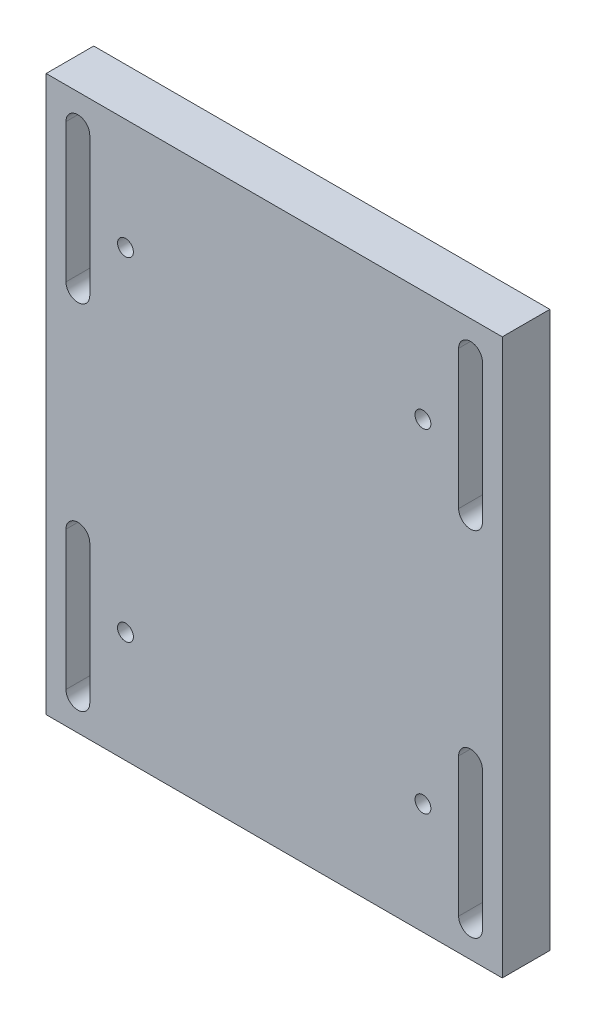
ISO-10303-21;
HEADER;
FILE_DESCRIPTION(('STEP AP214'),'2;1');
FILE_NAME('part.step','',(''),(''),'','','');
FILE_SCHEMA(('AUTOMOTIVE_DESIGN { 1 0 10303 214 1 1 1 1 }'));
ENDSEC;
DATA;
#1=APPLICATION_CONTEXT('core data for automotive mechanical design processes');
#2=APPLICATION_PROTOCOL_DEFINITION('international standard','automotive_design',2000,#1);
#3=PRODUCT_CONTEXT('',#1,'mechanical');
#4=PRODUCT('Part','Part','',(#3));
#5=PRODUCT_RELATED_PRODUCT_CATEGORY('part','',(#4));
#6=PRODUCT_DEFINITION_FORMATION('','',#4);
#7=PRODUCT_DEFINITION_CONTEXT('part definition',#1,'design');
#8=PRODUCT_DEFINITION('design','',#6,#7);
#9=PRODUCT_DEFINITION_SHAPE('','',#8);
#10=(LENGTH_UNIT() NAMED_UNIT(*) SI_UNIT(.MILLI.,.METRE.));
#11=(NAMED_UNIT(*) PLANE_ANGLE_UNIT() SI_UNIT($,.RADIAN.));
#12=(NAMED_UNIT(*) SI_UNIT($,.STERADIAN.) SOLID_ANGLE_UNIT());
#13=UNCERTAINTY_MEASURE_WITH_UNIT(LENGTH_MEASURE(1.E-05),#10,'distance_accuracy_value','');
#14=(GEOMETRIC_REPRESENTATION_CONTEXT(3) GLOBAL_UNCERTAINTY_ASSIGNED_CONTEXT((#13)) GLOBAL_UNIT_ASSIGNED_CONTEXT((#10,
#11,#12)) REPRESENTATION_CONTEXT('',''));
#15=CARTESIAN_POINT('',(0.,0.,0.));
#16=DIRECTION('',(0.,0.,1.));
#17=DIRECTION('',(1.,0.,0.));
#18=AXIS2_PLACEMENT_3D('',#15,#16,#17);
#19=CARTESIAN_POINT('',(57.5,70.,6.));
#20=DIRECTION('',(-1.,0.,0.));
#21=DIRECTION('',(0.,-1.,0.));
#22=AXIS2_PLACEMENT_3D('',#19,#20,#21);
#23=PLANE('',#22);
#24=DIRECTION('',(0.,1.,0.));
#25=VECTOR('',#24,1.);
#26=CARTESIAN_POINT('',(57.5,70.,-6.));
#27=LINE('',#26,#25);
#28=CARTESIAN_POINT('',(57.5,-70.,-6.));
#29=VERTEX_POINT('',#28);
#30=CARTESIAN_POINT('',(57.5,70.,-6.));
#31=VERTEX_POINT('',#30);
#32=EDGE_CURVE('E311',#29,#31,#27,.T.);
#33=ORIENTED_EDGE('',*,*,#32,.T.);
#34=DIRECTION('',(0.,0.,-1.));
#35=VECTOR('',#34,1.);
#36=CARTESIAN_POINT('',(57.5,70.,6.));
#37=LINE('',#36,#35);
#38=CARTESIAN_POINT('',(57.5,70.,6.));
#39=VERTEX_POINT('',#38);
#40=EDGE_CURVE('E11',#39,#31,#37,.T.);
#41=ORIENTED_EDGE('',*,*,#40,.F.);
#42=DIRECTION('',(0.,1.,0.));
#43=VECTOR('',#42,1.);
#44=CARTESIAN_POINT('',(57.5,70.,6.));
#45=LINE('',#44,#43);
#46=CARTESIAN_POINT('',(57.5,-70.,6.));
#47=VERTEX_POINT('',#46);
#48=EDGE_CURVE('E312',#47,#39,#45,.T.);
#49=ORIENTED_EDGE('',*,*,#48,.F.);
#50=DIRECTION('',(0.,0.,-1.));
#51=VECTOR('',#50,1.);
#52=CARTESIAN_POINT('',(57.5,-70.,6.));
#53=LINE('',#52,#51);
#54=EDGE_CURVE('E322',#47,#29,#53,.T.);
#55=ORIENTED_EDGE('',*,*,#54,.T.);
#56=EDGE_LOOP('',(#33,#41,#49,#55));
#57=FACE_BOUND('',#56,.T.);
#58=ADVANCED_FACE('F33',(#57),#23,.F.);
#59=CARTESIAN_POINT('',(-57.5,70.,6.));
#60=DIRECTION('',(0.,-1.,0.));
#61=DIRECTION('',(0.,0.,-1.));
#62=AXIS2_PLACEMENT_3D('',#59,#60,#61);
#63=PLANE('',#62);
#64=DIRECTION('',(-1.,0.,0.));
#65=VECTOR('',#64,1.);
#66=CARTESIAN_POINT('',(-57.5,70.,-6.));
#67=LINE('',#66,#65);
#68=CARTESIAN_POINT('',(-57.5,70.,-6.));
#69=VERTEX_POINT('',#68);
#70=EDGE_CURVE('E325',#31,#69,#67,.T.);
#71=ORIENTED_EDGE('',*,*,#70,.T.);
#72=DIRECTION('',(0.,0.,-1.));
#73=VECTOR('',#72,1.);
#74=CARTESIAN_POINT('',(-57.5,70.,6.));
#75=LINE('',#74,#73);
#76=CARTESIAN_POINT('',(-57.5,70.,6.));
#77=VERTEX_POINT('',#76);
#78=EDGE_CURVE('E40',#77,#69,#75,.T.);
#79=ORIENTED_EDGE('',*,*,#78,.F.);
#80=DIRECTION('',(-1.,0.,0.));
#81=VECTOR('',#80,1.);
#82=CARTESIAN_POINT('',(-57.5,70.,6.));
#83=LINE('',#82,#81);
#84=EDGE_CURVE('E315',#39,#77,#83,.T.);
#85=ORIENTED_EDGE('',*,*,#84,.F.);
#86=ORIENTED_EDGE('',*,*,#40,.T.);
#87=EDGE_LOOP('',(#71,#79,#85,#86));
#88=FACE_BOUND('',#87,.T.);
#89=ADVANCED_FACE('F354',(#88),#63,.F.);
#90=CARTESIAN_POINT('',(-57.5,70.,6.));
#91=DIRECTION('',(1.,0.,0.));
#92=DIRECTION('',(0.,1.,0.));
#93=AXIS2_PLACEMENT_3D('',#90,#91,#92);
#94=PLANE('',#93);
#95=DIRECTION('',(0.,-1.,0.));
#96=VECTOR('',#95,1.);
#97=CARTESIAN_POINT('',(-57.5,70.,-6.));
#98=LINE('',#97,#96);
#99=CARTESIAN_POINT('',(-57.5,-70.,-6.));
#100=VERTEX_POINT('',#99);
#101=EDGE_CURVE('E327',#69,#100,#98,.T.);
#102=ORIENTED_EDGE('',*,*,#101,.T.);
#103=DIRECTION('',(0.,0.,-1.));
#104=VECTOR('',#103,1.);
#105=CARTESIAN_POINT('',(-57.5,-70.,6.));
#106=LINE('',#105,#104);
#107=CARTESIAN_POINT('',(-57.5,-70.,6.));
#108=VERTEX_POINT('',#107);
#109=EDGE_CURVE('E332',#108,#100,#106,.T.);
#110=ORIENTED_EDGE('',*,*,#109,.F.);
#111=DIRECTION('',(0.,-1.,0.));
#112=VECTOR('',#111,1.);
#113=CARTESIAN_POINT('',(-57.5,70.,6.));
#114=LINE('',#113,#112);
#115=EDGE_CURVE('E318',#77,#108,#114,.T.);
#116=ORIENTED_EDGE('',*,*,#115,.F.);
#117=ORIENTED_EDGE('',*,*,#78,.T.);
#118=EDGE_LOOP('',(#102,#110,#116,#117));
#119=FACE_BOUND('',#118,.T.);
#120=ADVANCED_FACE('F339',(#119),#94,.F.);
#121=CARTESIAN_POINT('',(-57.5,-70.,6.));
#122=DIRECTION('',(0.,1.,0.));
#123=DIRECTION('',(0.,0.,1.));
#124=AXIS2_PLACEMENT_3D('',#121,#122,#123);
#125=PLANE('',#124);
#126=DIRECTION('',(1.,0.,0.));
#127=VECTOR('',#126,1.);
#128=CARTESIAN_POINT('',(-57.5,-70.,-6.));
#129=LINE('',#128,#127);
#130=EDGE_CURVE('E316',#100,#29,#129,.T.);
#131=ORIENTED_EDGE('',*,*,#130,.T.);
#132=ORIENTED_EDGE('',*,*,#54,.F.);
#133=DIRECTION('',(1.,0.,0.));
#134=VECTOR('',#133,1.);
#135=CARTESIAN_POINT('',(-57.5,-70.,6.));
#136=LINE('',#135,#134);
#137=EDGE_CURVE('E320',#108,#47,#136,.T.);
#138=ORIENTED_EDGE('',*,*,#137,.F.);
#139=ORIENTED_EDGE('',*,*,#109,.T.);
#140=EDGE_LOOP('',(#131,#132,#138,#139));
#141=FACE_BOUND('',#140,.T.);
#142=ADVANCED_FACE('F348',(#141),#125,.F.);
#143=CARTESIAN_POINT('',(0.,0.,6.));
#144=DIRECTION('',(0.,0.,1.));
#145=DIRECTION('',(1.,0.,0.));
#146=AXIS2_PLACEMENT_3D('',#143,#144,#145);
#147=PLANE('',#146);
#148=CARTESIAN_POINT('',(-37.5,42.,6.));
#149=DIRECTION('',(0.,0.,-1.));
#150=DIRECTION('',(-1.,0.,0.));
#151=AXIS2_PLACEMENT_3D('',#148,#149,#150);
#152=CIRCLE('',#151,2.);
#153=CARTESIAN_POINT('',(-39.5,42.,6.));
#154=VERTEX_POINT('',#153);
#155=EDGE_CURVE('E451',#154,#154,#152,.T.);
#156=ORIENTED_EDGE('',*,*,#155,.T.);
#157=EDGE_LOOP('',(#156));
#158=FACE_BOUND('',#157,.T.);
#159=CARTESIAN_POINT('',(-49.5,27.,6.));
#160=DIRECTION('',(0.,0.,-1.));
#161=DIRECTION('',(-1.,0.,0.));
#162=AXIS2_PLACEMENT_3D('',#159,#160,#161);
#163=CIRCLE('',#162,3.);
#164=CARTESIAN_POINT('',(-46.5,27.,6.));
#165=VERTEX_POINT('',#164);
#166=CARTESIAN_POINT('',(-52.5,27.,6.));
#167=VERTEX_POINT('',#166);
#168=EDGE_CURVE('E189',#165,#167,#163,.T.);
#169=ORIENTED_EDGE('',*,*,#168,.T.);
#170=DIRECTION('',(0.,1.,0.));
#171=VECTOR('',#170,1.);
#172=CARTESIAN_POINT('',(-52.5,62.,6.));
#173=LINE('',#172,#171);
#174=CARTESIAN_POINT('',(-52.5,62.,6.));
#175=VERTEX_POINT('',#174);
#176=EDGE_CURVE('E172',#167,#175,#173,.T.);
#177=ORIENTED_EDGE('',*,*,#176,.T.);
#178=CARTESIAN_POINT('',(-49.5,62.,6.));
#179=DIRECTION('',(0.,0.,-1.));
#180=DIRECTION('',(-1.,0.,0.));
#181=AXIS2_PLACEMENT_3D('',#178,#179,#180);
#182=CIRCLE('',#181,3.);
#183=CARTESIAN_POINT('',(-46.5,62.,6.));
#184=VERTEX_POINT('',#183);
#185=EDGE_CURVE('E180',#175,#184,#182,.T.);
#186=ORIENTED_EDGE('',*,*,#185,.T.);
#187=DIRECTION('',(0.,-1.,0.));
#188=VECTOR('',#187,1.);
#189=CARTESIAN_POINT('',(-46.5,27.,6.));
#190=LINE('',#189,#188);
#191=EDGE_CURVE('E47',#184,#165,#190,.T.);
#192=ORIENTED_EDGE('',*,*,#191,.T.);
#193=EDGE_LOOP('',(#169,#177,#186,#192));
#194=FACE_BOUND('',#193,.T.);
#195=CARTESIAN_POINT('',(-37.5,-42.,6.));
#196=DIRECTION('',(0.,0.,1.));
#197=DIRECTION('',(-1.,0.,0.));
#198=AXIS2_PLACEMENT_3D('',#195,#196,#197);
#199=CIRCLE('',#198,2.);
#200=CARTESIAN_POINT('',(-39.5,-42.,6.));
#201=VERTEX_POINT('',#200);
#202=EDGE_CURVE('E201',#201,#201,#199,.T.);
#203=ORIENTED_EDGE('',*,*,#202,.F.);
#204=EDGE_LOOP('',(#203));
#205=FACE_BOUND('',#204,.T.);
#206=CARTESIAN_POINT('',(-49.5,-62.,6.));
#207=DIRECTION('',(0.,0.,1.));
#208=DIRECTION('',(-1.,0.,0.));
#209=AXIS2_PLACEMENT_3D('',#206,#207,#208);
#210=CIRCLE('',#209,3.);
#211=CARTESIAN_POINT('',(-52.5,-62.,6.));
#212=VERTEX_POINT('',#211);
#213=CARTESIAN_POINT('',(-46.5,-62.,6.));
#214=VERTEX_POINT('',#213);
#215=EDGE_CURVE('E208',#212,#214,#210,.T.);
#216=ORIENTED_EDGE('',*,*,#215,.F.);
#217=DIRECTION('',(0.,-1.,0.));
#218=VECTOR('',#217,1.);
#219=CARTESIAN_POINT('',(-52.5,-62.,6.));
#220=LINE('',#219,#218);
#221=CARTESIAN_POINT('',(-52.5,-27.,6.));
#222=VERTEX_POINT('',#221);
#223=EDGE_CURVE('E225',#222,#212,#220,.T.);
#224=ORIENTED_EDGE('',*,*,#223,.F.);
#225=CARTESIAN_POINT('',(-49.5,-27.,6.));
#226=DIRECTION('',(0.,0.,1.));
#227=DIRECTION('',(-1.,0.,0.));
#228=AXIS2_PLACEMENT_3D('',#225,#226,#227);
#229=CIRCLE('',#228,3.);
#230=CARTESIAN_POINT('',(-46.5,-27.,6.));
#231=VERTEX_POINT('',#230);
#232=EDGE_CURVE('E222',#231,#222,#229,.T.);
#233=ORIENTED_EDGE('',*,*,#232,.F.);
#234=DIRECTION('',(0.,1.,0.));
#235=VECTOR('',#234,1.);
#236=CARTESIAN_POINT('',(-46.5,-27.,6.));
#237=LINE('',#236,#235);
#238=EDGE_CURVE('E219',#214,#231,#237,.T.);
#239=ORIENTED_EDGE('',*,*,#238,.F.);
#240=EDGE_LOOP('',(#216,#224,#233,#239));
#241=FACE_BOUND('',#240,.T.);
#242=CARTESIAN_POINT('',(37.5,-42.,6.));
#243=DIRECTION('',(0.,0.,-1.));
#244=DIRECTION('',(1.,0.,0.));
#245=AXIS2_PLACEMENT_3D('',#242,#243,#244);
#246=CIRCLE('',#245,2.);
#247=CARTESIAN_POINT('',(39.5,-42.,6.));
#248=VERTEX_POINT('',#247);
#249=EDGE_CURVE('E237',#248,#248,#246,.T.);
#250=ORIENTED_EDGE('',*,*,#249,.T.);
#251=EDGE_LOOP('',(#250));
#252=FACE_BOUND('',#251,.T.);
#253=CARTESIAN_POINT('',(49.5,-27.,6.));
#254=DIRECTION('',(0.,0.,-1.));
#255=DIRECTION('',(1.,0.,0.));
#256=AXIS2_PLACEMENT_3D('',#253,#254,#255);
#257=CIRCLE('',#256,3.);
#258=CARTESIAN_POINT('',(46.5,-27.,6.));
#259=VERTEX_POINT('',#258);
#260=CARTESIAN_POINT('',(52.5,-27.,6.));
#261=VERTEX_POINT('',#260);
#262=EDGE_CURVE('E260',#259,#261,#257,.T.);
#263=ORIENTED_EDGE('',*,*,#262,.T.);
#264=DIRECTION('',(0.,-1.,0.));
#265=VECTOR('',#264,1.);
#266=CARTESIAN_POINT('',(52.5,-62.,6.));
#267=LINE('',#266,#265);
#268=CARTESIAN_POINT('',(52.5,-62.,6.));
#269=VERTEX_POINT('',#268);
#270=EDGE_CURVE('E257',#261,#269,#267,.T.);
#271=ORIENTED_EDGE('',*,*,#270,.T.);
#272=CARTESIAN_POINT('',(49.5,-62.,6.));
#273=DIRECTION('',(0.,0.,-1.));
#274=DIRECTION('',(1.,0.,0.));
#275=AXIS2_PLACEMENT_3D('',#272,#273,#274);
#276=CIRCLE('',#275,3.);
#277=CARTESIAN_POINT('',(46.5,-62.,6.));
#278=VERTEX_POINT('',#277);
#279=EDGE_CURVE('E243',#269,#278,#276,.T.);
#280=ORIENTED_EDGE('',*,*,#279,.T.);
#281=DIRECTION('',(0.,1.,0.));
#282=VECTOR('',#281,1.);
#283=CARTESIAN_POINT('',(46.5,-27.,6.));
#284=LINE('',#283,#282);
#285=EDGE_CURVE('E263',#278,#259,#284,.T.);
#286=ORIENTED_EDGE('',*,*,#285,.T.);
#287=EDGE_LOOP('',(#263,#271,#280,#286));
#288=FACE_BOUND('',#287,.T.);
#289=CARTESIAN_POINT('',(37.5,42.,6.));
#290=DIRECTION('',(0.,0.,1.));
#291=DIRECTION('',(1.,0.,0.));
#292=AXIS2_PLACEMENT_3D('',#289,#290,#291);
#293=CIRCLE('',#292,2.);
#294=CARTESIAN_POINT('',(39.5,42.,6.));
#295=VERTEX_POINT('',#294);
#296=EDGE_CURVE('E254',#295,#295,#293,.T.);
#297=ORIENTED_EDGE('',*,*,#296,.F.);
#298=EDGE_LOOP('',(#297));
#299=FACE_BOUND('',#298,.T.);
#300=CARTESIAN_POINT('',(49.5,62.,6.));
#301=DIRECTION('',(0.,0.,1.));
#302=DIRECTION('',(1.,0.,0.));
#303=AXIS2_PLACEMENT_3D('',#300,#301,#302);
#304=CIRCLE('',#303,3.);
#305=CARTESIAN_POINT('',(52.5,62.,6.));
#306=VERTEX_POINT('',#305);
#307=CARTESIAN_POINT('',(46.5,62.,6.));
#308=VERTEX_POINT('',#307);
#309=EDGE_CURVE('E282',#306,#308,#304,.T.);
#310=ORIENTED_EDGE('',*,*,#309,.F.);
#311=DIRECTION('',(0.,1.,0.));
#312=VECTOR('',#311,1.);
#313=CARTESIAN_POINT('',(52.5,62.,6.));
#314=LINE('',#313,#312);
#315=CARTESIAN_POINT('',(52.5,27.,6.));
#316=VERTEX_POINT('',#315);
#317=EDGE_CURVE('E299',#316,#306,#314,.T.);
#318=ORIENTED_EDGE('',*,*,#317,.F.);
#319=CARTESIAN_POINT('',(49.5,27.,6.));
#320=DIRECTION('',(0.,0.,1.));
#321=DIRECTION('',(1.,0.,0.));
#322=AXIS2_PLACEMENT_3D('',#319,#320,#321);
#323=CIRCLE('',#322,3.);
#324=CARTESIAN_POINT('',(46.5,27.,6.));
#325=VERTEX_POINT('',#324);
#326=EDGE_CURVE('E296',#325,#316,#323,.T.);
#327=ORIENTED_EDGE('',*,*,#326,.F.);
#328=DIRECTION('',(0.,-1.,0.));
#329=VECTOR('',#328,1.);
#330=CARTESIAN_POINT('',(46.5,27.,6.));
#331=LINE('',#330,#329);
#332=EDGE_CURVE('E293',#308,#325,#331,.T.);
#333=ORIENTED_EDGE('',*,*,#332,.F.);
#334=EDGE_LOOP('',(#310,#318,#327,#333));
#335=FACE_BOUND('',#334,.T.);
#336=ORIENTED_EDGE('',*,*,#48,.T.);
#337=ORIENTED_EDGE('',*,*,#84,.T.);
#338=ORIENTED_EDGE('',*,*,#115,.T.);
#339=ORIENTED_EDGE('',*,*,#137,.T.);
#340=EDGE_LOOP('',(#336,#337,#338,#339));
#341=FACE_BOUND('',#340,.T.);
#342=ADVANCED_FACE('F186',(#158,#194,#205,#241,#252,#288,#299,#335,#341),#147,.T.);
#343=CARTESIAN_POINT('',(0.,0.,-6.));
#344=DIRECTION('',(0.,0.,1.));
#345=DIRECTION('',(1.,0.,0.));
#346=AXIS2_PLACEMENT_3D('',#343,#344,#345);
#347=PLANE('',#346);
#348=CARTESIAN_POINT('',(-37.5,42.,-6.));
#349=DIRECTION('',(0.,0.,1.));
#350=DIRECTION('',(1.,0.,0.));
#351=AXIS2_PLACEMENT_3D('',#348,#349,#350);
#352=CIRCLE('',#351,2.);
#353=CARTESIAN_POINT('',(-35.5,42.,-6.));
#354=VERTEX_POINT('',#353);
#355=EDGE_CURVE('E184',#354,#354,#352,.T.);
#356=ORIENTED_EDGE('',*,*,#355,.T.);
#357=EDGE_LOOP('',(#356));
#358=FACE_BOUND('',#357,.T.);
#359=DIRECTION('',(0.,-1.,0.));
#360=VECTOR('',#359,1.);
#361=CARTESIAN_POINT('',(-52.5,62.,-6.));
#362=LINE('',#361,#360);
#363=CARTESIAN_POINT('',(-52.5,62.,-6.));
#364=VERTEX_POINT('',#363);
#365=CARTESIAN_POINT('',(-52.5,27.,-6.));
#366=VERTEX_POINT('',#365);
#367=EDGE_CURVE('E175',#364,#366,#362,.T.);
#368=ORIENTED_EDGE('',*,*,#367,.T.);
#369=CARTESIAN_POINT('',(-49.5,27.,-6.));
#370=DIRECTION('',(0.,0.,1.));
#371=DIRECTION('',(1.,0.,0.));
#372=AXIS2_PLACEMENT_3D('',#369,#370,#371);
#373=CIRCLE('',#372,3.);
#374=CARTESIAN_POINT('',(-46.5,27.,-6.));
#375=VERTEX_POINT('',#374);
#376=EDGE_CURVE('E200',#366,#375,#373,.T.);
#377=ORIENTED_EDGE('',*,*,#376,.T.);
#378=DIRECTION('',(0.,1.,0.));
#379=VECTOR('',#378,1.);
#380=CARTESIAN_POINT('',(-46.5,27.,-6.));
#381=LINE('',#380,#379);
#382=CARTESIAN_POINT('',(-46.5,62.,-6.));
#383=VERTEX_POINT('',#382);
#384=EDGE_CURVE('E457',#375,#383,#381,.T.);
#385=ORIENTED_EDGE('',*,*,#384,.T.);
#386=CARTESIAN_POINT('',(-49.5,62.,-6.));
#387=DIRECTION('',(0.,0.,1.));
#388=DIRECTION('',(1.,0.,0.));
#389=AXIS2_PLACEMENT_3D('',#386,#387,#388);
#390=CIRCLE('',#389,3.);
#391=EDGE_CURVE('E205',#383,#364,#390,.T.);
#392=ORIENTED_EDGE('',*,*,#391,.T.);
#393=EDGE_LOOP('',(#368,#377,#385,#392));
#394=FACE_BOUND('',#393,.T.);
#395=CARTESIAN_POINT('',(-37.5,-42.,-6.));
#396=DIRECTION('',(0.,0.,1.));
#397=DIRECTION('',(1.,0.,0.));
#398=AXIS2_PLACEMENT_3D('',#395,#396,#397);
#399=CIRCLE('',#398,2.);
#400=CARTESIAN_POINT('',(-35.5,-42.,-6.));
#401=VERTEX_POINT('',#400);
#402=EDGE_CURVE('E204',#401,#401,#399,.F.);
#403=ORIENTED_EDGE('',*,*,#402,.F.);
#404=EDGE_LOOP('',(#403));
#405=FACE_BOUND('',#404,.T.);
#406=DIRECTION('',(0.,1.,0.));
#407=VECTOR('',#406,1.);
#408=CARTESIAN_POINT('',(-52.5,-62.,-6.));
#409=LINE('',#408,#407);
#410=CARTESIAN_POINT('',(-52.5,-62.,-6.));
#411=VERTEX_POINT('',#410);
#412=CARTESIAN_POINT('',(-52.5,-27.,-6.));
#413=VERTEX_POINT('',#412);
#414=EDGE_CURVE('E212',#411,#413,#409,.T.);
#415=ORIENTED_EDGE('',*,*,#414,.F.);
#416=CARTESIAN_POINT('',(-49.5,-62.,-6.));
#417=DIRECTION('',(0.,0.,1.));
#418=DIRECTION('',(1.,0.,0.));
#419=AXIS2_PLACEMENT_3D('',#416,#417,#418);
#420=CIRCLE('',#419,3.);
#421=CARTESIAN_POINT('',(-46.5,-62.,-6.));
#422=VERTEX_POINT('',#421);
#423=EDGE_CURVE('E215',#422,#411,#420,.F.);
#424=ORIENTED_EDGE('',*,*,#423,.F.);
#425=DIRECTION('',(0.,-1.,0.));
#426=VECTOR('',#425,1.);
#427=CARTESIAN_POINT('',(-46.5,-27.,-6.));
#428=LINE('',#427,#426);
#429=CARTESIAN_POINT('',(-46.5,-27.,-6.));
#430=VERTEX_POINT('',#429);
#431=EDGE_CURVE('E217',#430,#422,#428,.T.);
#432=ORIENTED_EDGE('',*,*,#431,.F.);
#433=CARTESIAN_POINT('',(-49.5,-27.,-6.));
#434=DIRECTION('',(0.,0.,1.));
#435=DIRECTION('',(1.,0.,0.));
#436=AXIS2_PLACEMENT_3D('',#433,#434,#435);
#437=CIRCLE('',#436,3.);
#438=EDGE_CURVE('E209',#413,#430,#437,.F.);
#439=ORIENTED_EDGE('',*,*,#438,.F.);
#440=EDGE_LOOP('',(#415,#424,#432,#439));
#441=FACE_BOUND('',#440,.T.);
#442=CARTESIAN_POINT('',(37.5,-42.,-6.));
#443=DIRECTION('',(0.,0.,1.));
#444=DIRECTION('',(1.,0.,0.));
#445=AXIS2_PLACEMENT_3D('',#442,#443,#444);
#446=CIRCLE('',#445,2.);
#447=CARTESIAN_POINT('',(39.5,-42.,-6.));
#448=VERTEX_POINT('',#447);
#449=EDGE_CURVE('E240',#448,#448,#446,.T.);
#450=ORIENTED_EDGE('',*,*,#449,.T.);
#451=EDGE_LOOP('',(#450));
#452=FACE_BOUND('',#451,.T.);
#453=DIRECTION('',(0.,1.,0.));
#454=VECTOR('',#453,1.);
#455=CARTESIAN_POINT('',(52.5,-62.,-6.));
#456=LINE('',#455,#454);
#457=CARTESIAN_POINT('',(52.5,-62.,-6.));
#458=VERTEX_POINT('',#457);
#459=CARTESIAN_POINT('',(52.5,-27.,-6.));
#460=VERTEX_POINT('',#459);
#461=EDGE_CURVE('E248',#458,#460,#456,.T.);
#462=ORIENTED_EDGE('',*,*,#461,.T.);
#463=CARTESIAN_POINT('',(49.5,-27.,-6.));
#464=DIRECTION('',(0.,0.,1.));
#465=DIRECTION('',(1.,0.,0.));
#466=AXIS2_PLACEMENT_3D('',#463,#464,#465);
#467=CIRCLE('',#466,3.);
#468=CARTESIAN_POINT('',(46.5,-27.,-6.));
#469=VERTEX_POINT('',#468);
#470=EDGE_CURVE('E244',#460,#469,#467,.T.);
#471=ORIENTED_EDGE('',*,*,#470,.T.);
#472=DIRECTION('',(0.,-1.,0.));
#473=VECTOR('',#472,1.);
#474=CARTESIAN_POINT('',(46.5,-27.,-6.));
#475=LINE('',#474,#473);
#476=CARTESIAN_POINT('',(46.5,-62.,-6.));
#477=VERTEX_POINT('',#476);
#478=EDGE_CURVE('E247',#469,#477,#475,.T.);
#479=ORIENTED_EDGE('',*,*,#478,.T.);
#480=CARTESIAN_POINT('',(49.5,-62.,-6.));
#481=DIRECTION('',(0.,0.,1.));
#482=DIRECTION('',(1.,0.,0.));
#483=AXIS2_PLACEMENT_3D('',#480,#481,#482);
#484=CIRCLE('',#483,3.);
#485=EDGE_CURVE('E251',#477,#458,#484,.T.);
#486=ORIENTED_EDGE('',*,*,#485,.T.);
#487=EDGE_LOOP('',(#462,#471,#479,#486));
#488=FACE_BOUND('',#487,.T.);
#489=CARTESIAN_POINT('',(37.5,42.,-6.));
#490=DIRECTION('',(0.,0.,1.));
#491=DIRECTION('',(1.,0.,0.));
#492=AXIS2_PLACEMENT_3D('',#489,#490,#491);
#493=CIRCLE('',#492,2.);
#494=CARTESIAN_POINT('',(39.5,42.,-6.));
#495=VERTEX_POINT('',#494);
#496=EDGE_CURVE('E279',#495,#495,#493,.F.);
#497=ORIENTED_EDGE('',*,*,#496,.F.);
#498=EDGE_LOOP('',(#497));
#499=FACE_BOUND('',#498,.T.);
#500=DIRECTION('',(0.,-1.,0.));
#501=VECTOR('',#500,1.);
#502=CARTESIAN_POINT('',(52.5,62.,-6.));
#503=LINE('',#502,#501);
#504=CARTESIAN_POINT('',(52.5,62.,-6.));
#505=VERTEX_POINT('',#504);
#506=CARTESIAN_POINT('',(52.5,27.,-6.));
#507=VERTEX_POINT('',#506);
#508=EDGE_CURVE('E286',#505,#507,#503,.T.);
#509=ORIENTED_EDGE('',*,*,#508,.F.);
#510=CARTESIAN_POINT('',(49.5,62.,-6.));
#511=DIRECTION('',(0.,0.,1.));
#512=DIRECTION('',(1.,0.,0.));
#513=AXIS2_PLACEMENT_3D('',#510,#511,#512);
#514=CIRCLE('',#513,3.);
#515=CARTESIAN_POINT('',(46.5,62.,-6.));
#516=VERTEX_POINT('',#515);
#517=EDGE_CURVE('E289',#516,#505,#514,.F.);
#518=ORIENTED_EDGE('',*,*,#517,.F.);
#519=DIRECTION('',(0.,1.,0.));
#520=VECTOR('',#519,1.);
#521=CARTESIAN_POINT('',(46.5,27.,-6.));
#522=LINE('',#521,#520);
#523=CARTESIAN_POINT('',(46.5,27.,-6.));
#524=VERTEX_POINT('',#523);
#525=EDGE_CURVE('E291',#524,#516,#522,.T.);
#526=ORIENTED_EDGE('',*,*,#525,.F.);
#527=CARTESIAN_POINT('',(49.5,27.,-6.));
#528=DIRECTION('',(0.,0.,1.));
#529=DIRECTION('',(1.,0.,0.));
#530=AXIS2_PLACEMENT_3D('',#527,#528,#529);
#531=CIRCLE('',#530,3.);
#532=EDGE_CURVE('E283',#507,#524,#531,.F.);
#533=ORIENTED_EDGE('',*,*,#532,.F.);
#534=EDGE_LOOP('',(#509,#518,#526,#533));
#535=FACE_BOUND('',#534,.T.);
#536=ORIENTED_EDGE('',*,*,#32,.F.);
#537=ORIENTED_EDGE('',*,*,#130,.F.);
#538=ORIENTED_EDGE('',*,*,#101,.F.);
#539=ORIENTED_EDGE('',*,*,#70,.F.);
#540=EDGE_LOOP('',(#536,#537,#538,#539));
#541=FACE_BOUND('',#540,.T.);
#542=ADVANCED_FACE('F345',(#358,#394,#405,#441,#452,#488,#499,#535,#541),#347,.F.);
#543=CARTESIAN_POINT('',(49.5,62.,-47.4366987102013));
#544=DIRECTION('',(0.,0.,1.));
#545=DIRECTION('',(1.,0.,0.));
#546=AXIS2_PLACEMENT_3D('',#543,#544,#545);
#547=CYLINDRICAL_SURFACE('',#546,3.);
#548=ORIENTED_EDGE('',*,*,#517,.T.);
#549=DIRECTION('',(0.,0.,1.));
#550=VECTOR('',#549,1.);
#551=CARTESIAN_POINT('',(52.5,62.,-47.4366987102013));
#552=LINE('',#551,#550);
#553=EDGE_CURVE('E287',#505,#306,#552,.T.);
#554=ORIENTED_EDGE('',*,*,#553,.T.);
#555=ORIENTED_EDGE('',*,*,#309,.T.);
#556=DIRECTION('',(0.,0.,1.));
#557=VECTOR('',#556,1.);
#558=CARTESIAN_POINT('',(46.5,62.,-47.4366987102013));
#559=LINE('',#558,#557);
#560=EDGE_CURVE('E302',#516,#308,#559,.T.);
#561=ORIENTED_EDGE('',*,*,#560,.F.);
#562=EDGE_LOOP('',(#548,#554,#555,#561));
#563=FACE_BOUND('',#562,.T.);
#564=ADVANCED_FACE('F366',(#563),#547,.F.);
#565=CARTESIAN_POINT('',(52.5,62.,-47.4366987102013));
#566=DIRECTION('',(1.,0.,0.));
#567=DIRECTION('',(0.,0.,-1.));
#568=AXIS2_PLACEMENT_3D('',#565,#566,#567);
#569=PLANE('',#568);
#570=ORIENTED_EDGE('',*,*,#508,.T.);
#571=DIRECTION('',(0.,0.,1.));
#572=VECTOR('',#571,1.);
#573=CARTESIAN_POINT('',(52.5,27.,-47.4366987102013));
#574=LINE('',#573,#572);
#575=EDGE_CURVE('E304',#507,#316,#574,.T.);
#576=ORIENTED_EDGE('',*,*,#575,.T.);
#577=ORIENTED_EDGE('',*,*,#317,.T.);
#578=ORIENTED_EDGE('',*,*,#553,.F.);
#579=EDGE_LOOP('',(#570,#576,#577,#578));
#580=FACE_BOUND('',#579,.T.);
#581=ADVANCED_FACE('F373',(#580),#569,.F.);
#582=CARTESIAN_POINT('',(49.5,27.,-47.4366987102013));
#583=DIRECTION('',(0.,0.,1.));
#584=DIRECTION('',(1.,0.,0.));
#585=AXIS2_PLACEMENT_3D('',#582,#583,#584);
#586=CYLINDRICAL_SURFACE('',#585,3.);
#587=ORIENTED_EDGE('',*,*,#532,.T.);
#588=DIRECTION('',(0.,0.,1.));
#589=VECTOR('',#588,1.);
#590=CARTESIAN_POINT('',(46.5,27.,-47.4366987102013));
#591=LINE('',#590,#589);
#592=EDGE_CURVE('E306',#524,#325,#591,.T.);
#593=ORIENTED_EDGE('',*,*,#592,.T.);
#594=ORIENTED_EDGE('',*,*,#326,.T.);
#595=ORIENTED_EDGE('',*,*,#575,.F.);
#596=EDGE_LOOP('',(#587,#593,#594,#595));
#597=FACE_BOUND('',#596,.T.);
#598=ADVANCED_FACE('F379',(#597),#586,.F.);
#599=CARTESIAN_POINT('',(46.5,27.,-47.4366987102013));
#600=DIRECTION('',(-1.,0.,0.));
#601=DIRECTION('',(0.,0.,1.));
#602=AXIS2_PLACEMENT_3D('',#599,#600,#601);
#603=PLANE('',#602);
#604=ORIENTED_EDGE('',*,*,#525,.T.);
#605=ORIENTED_EDGE('',*,*,#560,.T.);
#606=ORIENTED_EDGE('',*,*,#332,.T.);
#607=ORIENTED_EDGE('',*,*,#592,.F.);
#608=EDGE_LOOP('',(#604,#605,#606,#607));
#609=FACE_BOUND('',#608,.T.);
#610=ADVANCED_FACE('F375',(#609),#603,.F.);
#611=CARTESIAN_POINT('',(37.5,42.,-11.6568542494924));
#612=DIRECTION('',(0.,0.,1.));
#613=DIRECTION('',(1.,0.,0.));
#614=AXIS2_PLACEMENT_3D('',#611,#612,#613);
#615=CYLINDRICAL_SURFACE('',#614,2.);
#616=ORIENTED_EDGE('',*,*,#496,.T.);
#617=EDGE_LOOP('',(#616));
#618=FACE_BOUND('',#617,.T.);
#619=ORIENTED_EDGE('',*,*,#296,.T.);
#620=EDGE_LOOP('',(#619));
#621=FACE_BOUND('',#620,.T.);
#622=ADVANCED_FACE('F378',(#618,#621),#615,.F.);
#623=CARTESIAN_POINT('',(52.5,-62.,-47.4366987102013));
#624=DIRECTION('',(-1.,0.,0.));
#625=DIRECTION('',(0.,0.,1.));
#626=AXIS2_PLACEMENT_3D('',#623,#624,#625);
#627=PLANE('',#626);
#628=DIRECTION('',(0.,0.,1.));
#629=VECTOR('',#628,1.);
#630=CARTESIAN_POINT('',(52.5,-62.,-47.4366987102013));
#631=LINE('',#630,#629);
#632=EDGE_CURVE('E266',#458,#269,#631,.T.);
#633=ORIENTED_EDGE('',*,*,#632,.T.);
#634=ORIENTED_EDGE('',*,*,#270,.F.);
#635=DIRECTION('',(0.,0.,1.));
#636=VECTOR('',#635,1.);
#637=CARTESIAN_POINT('',(52.5,-27.,-47.4366987102013));
#638=LINE('',#637,#636);
#639=EDGE_CURVE('E272',#460,#261,#638,.T.);
#640=ORIENTED_EDGE('',*,*,#639,.F.);
#641=ORIENTED_EDGE('',*,*,#461,.F.);
#642=EDGE_LOOP('',(#633,#634,#640,#641));
#643=FACE_BOUND('',#642,.T.);
#644=ADVANCED_FACE('F389',(#643),#627,.T.);
#645=CARTESIAN_POINT('',(49.5,-27.,-47.4366987102013));
#646=DIRECTION('',(0.,0.,1.));
#647=DIRECTION('',(1.,0.,0.));
#648=AXIS2_PLACEMENT_3D('',#645,#646,#647);
#649=CYLINDRICAL_SURFACE('',#648,3.);
#650=ORIENTED_EDGE('',*,*,#639,.T.);
#651=ORIENTED_EDGE('',*,*,#262,.F.);
#652=DIRECTION('',(0.,0.,1.));
#653=VECTOR('',#652,1.);
#654=CARTESIAN_POINT('',(46.5,-27.,-47.4366987102013));
#655=LINE('',#654,#653);
#656=EDGE_CURVE('E270',#469,#259,#655,.T.);
#657=ORIENTED_EDGE('',*,*,#656,.F.);
#658=ORIENTED_EDGE('',*,*,#470,.F.);
#659=EDGE_LOOP('',(#650,#651,#657,#658));
#660=FACE_BOUND('',#659,.T.);
#661=ADVANCED_FACE('F399',(#660),#649,.F.);
#662=CARTESIAN_POINT('',(46.5,-27.,-47.4366987102013));
#663=DIRECTION('',(1.,0.,0.));
#664=DIRECTION('',(0.,0.,-1.));
#665=AXIS2_PLACEMENT_3D('',#662,#663,#664);
#666=PLANE('',#665);
#667=ORIENTED_EDGE('',*,*,#656,.T.);
#668=ORIENTED_EDGE('',*,*,#285,.F.);
#669=DIRECTION('',(0.,0.,1.));
#670=VECTOR('',#669,1.);
#671=CARTESIAN_POINT('',(46.5,-62.,-47.4366987102013));
#672=LINE('',#671,#670);
#673=EDGE_CURVE('E267',#477,#278,#672,.T.);
#674=ORIENTED_EDGE('',*,*,#673,.F.);
#675=ORIENTED_EDGE('',*,*,#478,.F.);
#676=EDGE_LOOP('',(#667,#668,#674,#675));
#677=FACE_BOUND('',#676,.T.);
#678=ADVANCED_FACE('F395',(#677),#666,.T.);
#679=CARTESIAN_POINT('',(49.5,-62.,-47.4366987102013));
#680=DIRECTION('',(0.,0.,1.));
#681=DIRECTION('',(1.,0.,0.));
#682=AXIS2_PLACEMENT_3D('',#679,#680,#681);
#683=CYLINDRICAL_SURFACE('',#682,3.);
#684=ORIENTED_EDGE('',*,*,#673,.T.);
#685=ORIENTED_EDGE('',*,*,#279,.F.);
#686=ORIENTED_EDGE('',*,*,#632,.F.);
#687=ORIENTED_EDGE('',*,*,#485,.F.);
#688=EDGE_LOOP('',(#684,#685,#686,#687));
#689=FACE_BOUND('',#688,.T.);
#690=ADVANCED_FACE('F391',(#689),#683,.F.);
#691=CARTESIAN_POINT('',(37.5,-42.,-11.6568542494924));
#692=DIRECTION('',(0.,0.,1.));
#693=DIRECTION('',(1.,0.,0.));
#694=AXIS2_PLACEMENT_3D('',#691,#692,#693);
#695=CYLINDRICAL_SURFACE('',#694,2.);
#696=ORIENTED_EDGE('',*,*,#449,.F.);
#697=EDGE_LOOP('',(#696));
#698=FACE_BOUND('',#697,.T.);
#699=ORIENTED_EDGE('',*,*,#249,.F.);
#700=EDGE_LOOP('',(#699));
#701=FACE_BOUND('',#700,.T.);
#702=ADVANCED_FACE('F394',(#698,#701),#695,.F.);
#703=CARTESIAN_POINT('',(-49.5,-62.,-47.4366987102013));
#704=DIRECTION('',(0.,0.,1.));
#705=DIRECTION('',(1.,0.,0.));
#706=AXIS2_PLACEMENT_3D('',#703,#704,#705);
#707=CYLINDRICAL_SURFACE('',#706,3.);
#708=ORIENTED_EDGE('',*,*,#423,.T.);
#709=DIRECTION('',(0.,0.,1.));
#710=VECTOR('',#709,1.);
#711=CARTESIAN_POINT('',(-52.5,-62.,-47.4366987102013));
#712=LINE('',#711,#710);
#713=EDGE_CURVE('E213',#411,#212,#712,.T.);
#714=ORIENTED_EDGE('',*,*,#713,.T.);
#715=ORIENTED_EDGE('',*,*,#215,.T.);
#716=DIRECTION('',(0.,0.,1.));
#717=VECTOR('',#716,1.);
#718=CARTESIAN_POINT('',(-46.5,-62.,-47.4366987102013));
#719=LINE('',#718,#717);
#720=EDGE_CURVE('E228',#422,#214,#719,.T.);
#721=ORIENTED_EDGE('',*,*,#720,.F.);
#722=EDGE_LOOP('',(#708,#714,#715,#721));
#723=FACE_BOUND('',#722,.T.);
#724=ADVANCED_FACE('F409',(#723),#707,.F.);
#725=CARTESIAN_POINT('',(-52.5,-62.,-47.4366987102013));
#726=DIRECTION('',(-1.,0.,0.));
#727=DIRECTION('',(0.,0.,1.));
#728=AXIS2_PLACEMENT_3D('',#725,#726,#727);
#729=PLANE('',#728);
#730=ORIENTED_EDGE('',*,*,#414,.T.);
#731=DIRECTION('',(0.,0.,1.));
#732=VECTOR('',#731,1.);
#733=CARTESIAN_POINT('',(-52.5,-27.,-47.4366987102013));
#734=LINE('',#733,#732);
#735=EDGE_CURVE('E230',#413,#222,#734,.T.);
#736=ORIENTED_EDGE('',*,*,#735,.T.);
#737=ORIENTED_EDGE('',*,*,#223,.T.);
#738=ORIENTED_EDGE('',*,*,#713,.F.);
#739=EDGE_LOOP('',(#730,#736,#737,#738));
#740=FACE_BOUND('',#739,.T.);
#741=ADVANCED_FACE('F413',(#740),#729,.F.);
#742=CARTESIAN_POINT('',(-49.5,-27.,-47.4366987102013));
#743=DIRECTION('',(0.,0.,1.));
#744=DIRECTION('',(1.,0.,0.));
#745=AXIS2_PLACEMENT_3D('',#742,#743,#744);
#746=CYLINDRICAL_SURFACE('',#745,3.);
#747=ORIENTED_EDGE('',*,*,#438,.T.);
#748=DIRECTION('',(0.,0.,1.));
#749=VECTOR('',#748,1.);
#750=CARTESIAN_POINT('',(-46.5,-27.,-47.4366987102013));
#751=LINE('',#750,#749);
#752=EDGE_CURVE('E232',#430,#231,#751,.T.);
#753=ORIENTED_EDGE('',*,*,#752,.T.);
#754=ORIENTED_EDGE('',*,*,#232,.T.);
#755=ORIENTED_EDGE('',*,*,#735,.F.);
#756=EDGE_LOOP('',(#747,#753,#754,#755));
#757=FACE_BOUND('',#756,.T.);
#758=ADVANCED_FACE('F419',(#757),#746,.F.);
#759=CARTESIAN_POINT('',(-46.5,-27.,-47.4366987102013));
#760=DIRECTION('',(1.,0.,0.));
#761=DIRECTION('',(0.,0.,-1.));
#762=AXIS2_PLACEMENT_3D('',#759,#760,#761);
#763=PLANE('',#762);
#764=ORIENTED_EDGE('',*,*,#431,.T.);
#765=ORIENTED_EDGE('',*,*,#720,.T.);
#766=ORIENTED_EDGE('',*,*,#238,.T.);
#767=ORIENTED_EDGE('',*,*,#752,.F.);
#768=EDGE_LOOP('',(#764,#765,#766,#767));
#769=FACE_BOUND('',#768,.T.);
#770=ADVANCED_FACE('F415',(#769),#763,.F.);
#771=CARTESIAN_POINT('',(-37.5,-42.,-11.6568542494924));
#772=DIRECTION('',(0.,0.,1.));
#773=DIRECTION('',(1.,0.,0.));
#774=AXIS2_PLACEMENT_3D('',#771,#772,#773);
#775=CYLINDRICAL_SURFACE('',#774,2.);
#776=ORIENTED_EDGE('',*,*,#402,.T.);
#777=EDGE_LOOP('',(#776));
#778=FACE_BOUND('',#777,.T.);
#779=ORIENTED_EDGE('',*,*,#202,.T.);
#780=EDGE_LOOP('',(#779));
#781=FACE_BOUND('',#780,.T.);
#782=ADVANCED_FACE('F418',(#778,#781),#775,.F.);
#783=CARTESIAN_POINT('',(-52.5,62.,-47.4366987102013));
#784=DIRECTION('',(1.,0.,0.));
#785=DIRECTION('',(0.,0.,-1.));
#786=AXIS2_PLACEMENT_3D('',#783,#784,#785);
#787=PLANE('',#786);
#788=DIRECTION('',(0.,0.,1.));
#789=VECTOR('',#788,1.);
#790=CARTESIAN_POINT('',(-52.5,62.,-47.4366987102013));
#791=LINE('',#790,#789);
#792=EDGE_CURVE('E55',#364,#175,#791,.T.);
#793=ORIENTED_EDGE('',*,*,#792,.T.);
#794=ORIENTED_EDGE('',*,*,#176,.F.);
#795=DIRECTION('',(0.,0.,1.));
#796=VECTOR('',#795,1.);
#797=CARTESIAN_POINT('',(-52.5,27.,-47.4366987102013));
#798=LINE('',#797,#796);
#799=EDGE_CURVE('E177',#366,#167,#798,.T.);
#800=ORIENTED_EDGE('',*,*,#799,.F.);
#801=ORIENTED_EDGE('',*,*,#367,.F.);
#802=EDGE_LOOP('',(#793,#794,#800,#801));
#803=FACE_BOUND('',#802,.T.);
#804=ADVANCED_FACE('F169',(#803),#787,.T.);
#805=CARTESIAN_POINT('',(-49.5,27.,-47.4366987102013));
#806=DIRECTION('',(0.,0.,1.));
#807=DIRECTION('',(1.,0.,0.));
#808=AXIS2_PLACEMENT_3D('',#805,#806,#807);
#809=CYLINDRICAL_SURFACE('',#808,3.);
#810=ORIENTED_EDGE('',*,*,#799,.T.);
#811=ORIENTED_EDGE('',*,*,#168,.F.);
#812=DIRECTION('',(0.,0.,1.));
#813=VECTOR('',#812,1.);
#814=CARTESIAN_POINT('',(-46.5,27.,-47.4366987102013));
#815=LINE('',#814,#813);
#816=EDGE_CURVE('E196',#375,#165,#815,.T.);
#817=ORIENTED_EDGE('',*,*,#816,.F.);
#818=ORIENTED_EDGE('',*,*,#376,.F.);
#819=EDGE_LOOP('',(#810,#811,#817,#818));
#820=FACE_BOUND('',#819,.T.);
#821=ADVANCED_FACE('F436',(#820),#809,.F.);
#822=CARTESIAN_POINT('',(-46.5,27.,-47.4366987102013));
#823=DIRECTION('',(-1.,0.,0.));
#824=DIRECTION('',(0.,0.,1.));
#825=AXIS2_PLACEMENT_3D('',#822,#823,#824);
#826=PLANE('',#825);
#827=ORIENTED_EDGE('',*,*,#816,.T.);
#828=ORIENTED_EDGE('',*,*,#191,.F.);
#829=DIRECTION('',(0.,0.,1.));
#830=VECTOR('',#829,1.);
#831=CARTESIAN_POINT('',(-46.5,62.,-47.4366987102013));
#832=LINE('',#831,#830);
#833=EDGE_CURVE('E182',#383,#184,#832,.T.);
#834=ORIENTED_EDGE('',*,*,#833,.F.);
#835=ORIENTED_EDGE('',*,*,#384,.F.);
#836=EDGE_LOOP('',(#827,#828,#834,#835));
#837=FACE_BOUND('',#836,.T.);
#838=ADVANCED_FACE('F433',(#837),#826,.T.);
#839=CARTESIAN_POINT('',(-49.5,62.,-47.4366987102013));
#840=DIRECTION('',(0.,0.,1.));
#841=DIRECTION('',(1.,0.,0.));
#842=AXIS2_PLACEMENT_3D('',#839,#840,#841);
#843=CYLINDRICAL_SURFACE('',#842,3.);
#844=ORIENTED_EDGE('',*,*,#833,.T.);
#845=ORIENTED_EDGE('',*,*,#185,.F.);
#846=ORIENTED_EDGE('',*,*,#792,.F.);
#847=ORIENTED_EDGE('',*,*,#391,.F.);
#848=EDGE_LOOP('',(#844,#845,#846,#847));
#849=FACE_BOUND('',#848,.T.);
#850=ADVANCED_FACE('F181',(#849),#843,.F.);
#851=CARTESIAN_POINT('',(-37.5,42.,-11.6568542494924));
#852=DIRECTION('',(0.,0.,1.));
#853=DIRECTION('',(1.,0.,0.));
#854=AXIS2_PLACEMENT_3D('',#851,#852,#853);
#855=CYLINDRICAL_SURFACE('',#854,2.);
#856=ORIENTED_EDGE('',*,*,#355,.F.);
#857=EDGE_LOOP('',(#856));
#858=FACE_BOUND('',#857,.T.);
#859=ORIENTED_EDGE('',*,*,#155,.F.);
#860=EDGE_LOOP('',(#859));
#861=FACE_BOUND('',#860,.T.);
#862=ADVANCED_FACE('F432',(#858,#861),#855,.F.);
#863=CLOSED_SHELL('',(#58,#89,#120,#142,#342,#542,#564,#581,#598,#610,#622,#644,#661,#678,#690,
#702,#724,#741,#758,#770,#782,#804,#821,#838,#850,#862));
#864=MANIFOLD_SOLID_BREP('B2',#863);
#865=ADVANCED_BREP_SHAPE_REPRESENTATION('',(#18,#864),#14);
#866=SHAPE_DEFINITION_REPRESENTATION(#9,#865);
ENDSEC;
END-ISO-10303-21;
